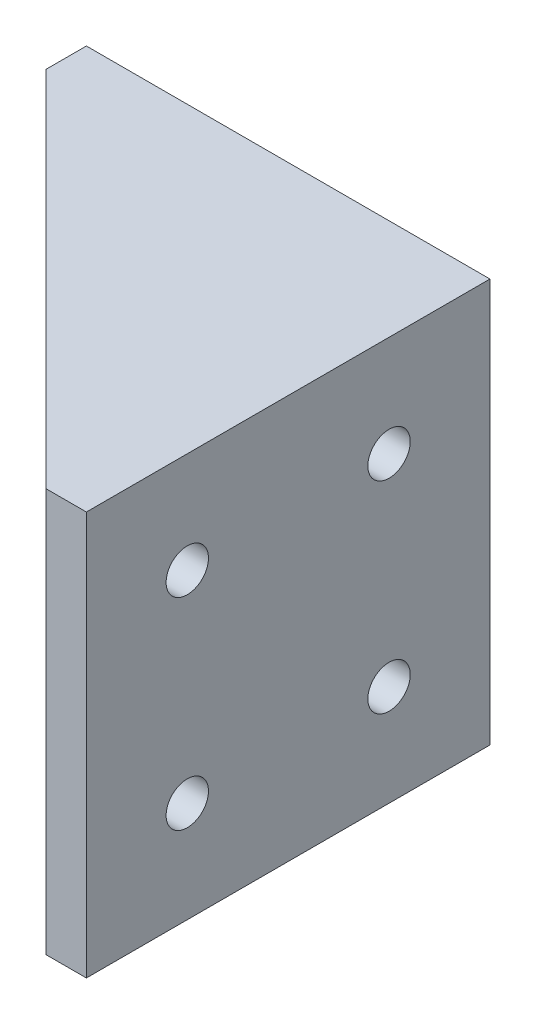
ISO-10303-21;
HEADER;
FILE_DESCRIPTION(('STEP AP214'),'2;1');
FILE_NAME('part.step','',(''),(''),'','','');
FILE_SCHEMA(('AUTOMOTIVE_DESIGN { 1 0 10303 214 1 1 1 1 }'));
ENDSEC;
DATA;
#1=APPLICATION_CONTEXT('core data for automotive mechanical design processes');
#2=APPLICATION_PROTOCOL_DEFINITION('international standard','automotive_design',2000,#1);
#3=PRODUCT_CONTEXT('',#1,'mechanical');
#4=PRODUCT('Part','Part','',(#3));
#5=PRODUCT_RELATED_PRODUCT_CATEGORY('part','',(#4));
#6=PRODUCT_DEFINITION_FORMATION('','',#4);
#7=PRODUCT_DEFINITION_CONTEXT('part definition',#1,'design');
#8=PRODUCT_DEFINITION('design','',#6,#7);
#9=PRODUCT_DEFINITION_SHAPE('','',#8);
#10=(LENGTH_UNIT() NAMED_UNIT(*) SI_UNIT(.MILLI.,.METRE.));
#11=(NAMED_UNIT(*) PLANE_ANGLE_UNIT() SI_UNIT($,.RADIAN.));
#12=(NAMED_UNIT(*) SI_UNIT($,.STERADIAN.) SOLID_ANGLE_UNIT());
#13=UNCERTAINTY_MEASURE_WITH_UNIT(LENGTH_MEASURE(1.E-05),#10,'distance_accuracy_value','');
#14=(GEOMETRIC_REPRESENTATION_CONTEXT(3) GLOBAL_UNCERTAINTY_ASSIGNED_CONTEXT((#13)) GLOBAL_UNIT_ASSIGNED_CONTEXT((#10,
#11,#12)) REPRESENTATION_CONTEXT('',''));
#15=CARTESIAN_POINT('',(0.,0.,0.));
#16=DIRECTION('',(0.,0.,1.));
#17=DIRECTION('',(1.,0.,0.));
#18=AXIS2_PLACEMENT_3D('',#15,#16,#17);
#19=CARTESIAN_POINT('',(-4.,40.,-36.));
#20=DIRECTION('',(0.,0.,-1.));
#21=DIRECTION('',(-1.,0.,0.));
#22=AXIS2_PLACEMENT_3D('',#19,#20,#21);
#23=PLANE('',#22);
#24=CARTESIAN_POINT('',(-30.,30.,-36.));
#25=DIRECTION('',(0.,0.,-1.));
#26=DIRECTION('',(-1.,0.,0.));
#27=AXIS2_PLACEMENT_3D('',#24,#25,#26);
#28=CIRCLE('',#27,2.1);
#29=CARTESIAN_POINT('',(-32.1,30.,-36.));
#30=VERTEX_POINT('',#29);
#31=EDGE_CURVE('E168',#30,#30,#28,.T.);
#32=ORIENTED_EDGE('',*,*,#31,.T.);
#33=EDGE_LOOP('',(#32));
#34=FACE_BOUND('',#33,.T.);
#35=CARTESIAN_POINT('',(-30.,10.,-36.));
#36=DIRECTION('',(0.,0.,-1.));
#37=DIRECTION('',(-1.,0.,0.));
#38=AXIS2_PLACEMENT_3D('',#35,#36,#37);
#39=CIRCLE('',#38,2.1);
#40=CARTESIAN_POINT('',(-32.1,10.,-36.));
#41=VERTEX_POINT('',#40);
#42=EDGE_CURVE('E198',#41,#41,#39,.T.);
#43=ORIENTED_EDGE('',*,*,#42,.T.);
#44=EDGE_LOOP('',(#43));
#45=FACE_BOUND('',#44,.T.);
#46=CARTESIAN_POINT('',(-10.,10.,-36.));
#47=DIRECTION('',(0.,0.,-1.));
#48=DIRECTION('',(-1.,0.,0.));
#49=AXIS2_PLACEMENT_3D('',#46,#47,#48);
#50=CIRCLE('',#49,2.1);
#51=CARTESIAN_POINT('',(-12.1,10.,-36.));
#52=VERTEX_POINT('',#51);
#53=EDGE_CURVE('E201',#52,#52,#50,.T.);
#54=ORIENTED_EDGE('',*,*,#53,.T.);
#55=EDGE_LOOP('',(#54));
#56=FACE_BOUND('',#55,.T.);
#57=CARTESIAN_POINT('',(-10.,30.,-36.));
#58=DIRECTION('',(0.,0.,-1.));
#59=DIRECTION('',(-1.,0.,0.));
#60=AXIS2_PLACEMENT_3D('',#57,#58,#59);
#61=CIRCLE('',#60,2.1);
#62=CARTESIAN_POINT('',(-12.1,30.,-36.));
#63=VERTEX_POINT('',#62);
#64=EDGE_CURVE('E112',#63,#63,#61,.T.);
#65=ORIENTED_EDGE('',*,*,#64,.T.);
#66=EDGE_LOOP('',(#65));
#67=FACE_BOUND('',#66,.T.);
#68=DIRECTION('',(1.,0.,0.));
#69=VECTOR('',#68,1.);
#70=CARTESIAN_POINT('',(-40.,4.,-36.));
#71=LINE('',#70,#69);
#72=CARTESIAN_POINT('',(-40.,4.,-36.));
#73=VERTEX_POINT('',#72);
#74=CARTESIAN_POINT('',(-4.,4.,-36.));
#75=VERTEX_POINT('',#74);
#76=EDGE_CURVE('E57',#73,#75,#71,.T.);
#77=ORIENTED_EDGE('',*,*,#76,.T.);
#78=DIRECTION('',(0.,-1.,0.));
#79=VECTOR('',#78,1.);
#80=CARTESIAN_POINT('',(-4.,40.,-36.));
#81=LINE('',#80,#79);
#82=CARTESIAN_POINT('',(-4.,36.,-36.));
#83=VERTEX_POINT('',#82);
#84=EDGE_CURVE('E186',#83,#75,#81,.T.);
#85=ORIENTED_EDGE('',*,*,#84,.F.);
#86=DIRECTION('',(-1.,0.,0.));
#87=VECTOR('',#86,1.);
#88=CARTESIAN_POINT('',(-4.,36.,-36.));
#89=LINE('',#88,#87);
#90=CARTESIAN_POINT('',(-40.,36.,-36.));
#91=VERTEX_POINT('',#90);
#92=EDGE_CURVE('E134',#83,#91,#89,.T.);
#93=ORIENTED_EDGE('',*,*,#92,.T.);
#94=DIRECTION('',(0.,-1.,0.));
#95=VECTOR('',#94,1.);
#96=CARTESIAN_POINT('',(-40.,40.,-36.));
#97=LINE('',#96,#95);
#98=EDGE_CURVE('E188',#91,#73,#97,.T.);
#99=ORIENTED_EDGE('',*,*,#98,.T.);
#100=EDGE_LOOP('',(#77,#85,#93,#99));
#101=FACE_BOUND('',#100,.T.);
#102=ADVANCED_FACE('F33',(#34,#45,#56,#67,#101),#23,.F.);
#103=CARTESIAN_POINT('',(-4.,40.,0.));
#104=DIRECTION('',(1.,0.,0.));
#105=DIRECTION('',(0.,0.,-1.));
#106=AXIS2_PLACEMENT_3D('',#103,#104,#105);
#107=PLANE('',#106);
#108=CARTESIAN_POINT('',(-4.,30.,-10.));
#109=DIRECTION('',(1.,0.,0.));
#110=DIRECTION('',(0.,0.,-1.));
#111=AXIS2_PLACEMENT_3D('',#108,#109,#110);
#112=CIRCLE('',#111,2.1);
#113=CARTESIAN_POINT('',(-4.,30.,-12.1));
#114=VERTEX_POINT('',#113);
#115=EDGE_CURVE('E155',#114,#114,#112,.T.);
#116=ORIENTED_EDGE('',*,*,#115,.T.);
#117=EDGE_LOOP('',(#116));
#118=FACE_BOUND('',#117,.T.);
#119=CARTESIAN_POINT('',(-4.,30.,-30.));
#120=DIRECTION('',(1.,0.,0.));
#121=DIRECTION('',(0.,0.,-1.));
#122=AXIS2_PLACEMENT_3D('',#119,#120,#121);
#123=CIRCLE('',#122,2.1);
#124=CARTESIAN_POINT('',(-4.,30.,-32.1));
#125=VERTEX_POINT('',#124);
#126=EDGE_CURVE('E208',#125,#125,#123,.T.);
#127=ORIENTED_EDGE('',*,*,#126,.T.);
#128=EDGE_LOOP('',(#127));
#129=FACE_BOUND('',#128,.T.);
#130=CARTESIAN_POINT('',(-4.,10.,-30.));
#131=DIRECTION('',(1.,0.,0.));
#132=DIRECTION('',(0.,0.,-1.));
#133=AXIS2_PLACEMENT_3D('',#130,#131,#132);
#134=CIRCLE('',#133,2.1);
#135=CARTESIAN_POINT('',(-4.,10.,-32.1));
#136=VERTEX_POINT('',#135);
#137=EDGE_CURVE('E210',#136,#136,#134,.T.);
#138=ORIENTED_EDGE('',*,*,#137,.T.);
#139=EDGE_LOOP('',(#138));
#140=FACE_BOUND('',#139,.T.);
#141=CARTESIAN_POINT('',(-4.,10.,-10.));
#142=DIRECTION('',(1.,0.,0.));
#143=DIRECTION('',(0.,0.,-1.));
#144=AXIS2_PLACEMENT_3D('',#141,#142,#143);
#145=CIRCLE('',#144,2.1);
#146=CARTESIAN_POINT('',(-4.,10.,-12.1));
#147=VERTEX_POINT('',#146);
#148=EDGE_CURVE('E37',#147,#147,#145,.T.);
#149=ORIENTED_EDGE('',*,*,#148,.T.);
#150=EDGE_LOOP('',(#149));
#151=FACE_BOUND('',#150,.T.);
#152=DIRECTION('',(0.,0.,1.));
#153=VECTOR('',#152,1.);
#154=CARTESIAN_POINT('',(-4.,4.,-36.));
#155=LINE('',#154,#153);
#156=CARTESIAN_POINT('',(-4.,4.,0.));
#157=VERTEX_POINT('',#156);
#158=EDGE_CURVE('E127',#75,#157,#155,.T.);
#159=ORIENTED_EDGE('',*,*,#158,.T.);
#160=DIRECTION('',(0.,-1.,0.));
#161=VECTOR('',#160,1.);
#162=CARTESIAN_POINT('',(-4.,40.,0.));
#163=LINE('',#162,#161);
#164=CARTESIAN_POINT('',(-4.,36.,0.));
#165=VERTEX_POINT('',#164);
#166=EDGE_CURVE('E119',#165,#157,#163,.T.);
#167=ORIENTED_EDGE('',*,*,#166,.F.);
#168=DIRECTION('',(0.,0.,-1.));
#169=VECTOR('',#168,1.);
#170=CARTESIAN_POINT('',(-4.,36.,0.));
#171=LINE('',#170,#169);
#172=EDGE_CURVE('E139',#165,#83,#171,.T.);
#173=ORIENTED_EDGE('',*,*,#172,.T.);
#174=ORIENTED_EDGE('',*,*,#84,.T.);
#175=EDGE_LOOP('',(#159,#167,#173,#174));
#176=FACE_BOUND('',#175,.T.);
#177=ADVANCED_FACE('F217',(#118,#129,#140,#151,#176),#107,.F.);
#178=CARTESIAN_POINT('',(0.,40.,0.));
#179=DIRECTION('',(0.,0.,-1.));
#180=DIRECTION('',(-1.,0.,0.));
#181=AXIS2_PLACEMENT_3D('',#178,#179,#180);
#182=PLANE('',#181);
#183=DIRECTION('',(1.,0.,0.));
#184=VECTOR('',#183,1.);
#185=CARTESIAN_POINT('',(0.,0.,0.));
#186=LINE('',#185,#184);
#187=CARTESIAN_POINT('',(-4.,0.,0.));
#188=VERTEX_POINT('',#187);
#189=CARTESIAN_POINT('',(0.,0.,0.));
#190=VERTEX_POINT('',#189);
#191=EDGE_CURVE('E102',#188,#190,#186,.T.);
#192=ORIENTED_EDGE('',*,*,#191,.T.);
#193=DIRECTION('',(0.,-1.,0.));
#194=VECTOR('',#193,1.);
#195=CARTESIAN_POINT('',(0.,40.,0.));
#196=LINE('',#195,#194);
#197=CARTESIAN_POINT('',(0.,40.,0.));
#198=VERTEX_POINT('',#197);
#199=EDGE_CURVE('E11',#198,#190,#196,.T.);
#200=ORIENTED_EDGE('',*,*,#199,.F.);
#201=DIRECTION('',(1.,0.,0.));
#202=VECTOR('',#201,1.);
#203=CARTESIAN_POINT('',(0.,40.,0.));
#204=LINE('',#203,#202);
#205=CARTESIAN_POINT('',(-4.,40.,0.));
#206=VERTEX_POINT('',#205);
#207=EDGE_CURVE('E169',#206,#198,#204,.T.);
#208=ORIENTED_EDGE('',*,*,#207,.F.);
#209=EDGE_CURVE('E184',#206,#165,#163,.T.);
#210=ORIENTED_EDGE('',*,*,#209,.T.);
#211=ORIENTED_EDGE('',*,*,#166,.T.);
#212=DIRECTION('',(0.,-1.,0.));
#213=VECTOR('',#212,1.);
#214=CARTESIAN_POINT('',(-4.,4.,0.));
#215=LINE('',#214,#213);
#216=EDGE_CURVE('E116',#157,#188,#215,.T.);
#217=ORIENTED_EDGE('',*,*,#216,.T.);
#218=EDGE_LOOP('',(#192,#200,#208,#210,#211,#217));
#219=FACE_BOUND('',#218,.T.);
#220=ADVANCED_FACE('F35',(#219),#182,.F.);
#221=CARTESIAN_POINT('',(0.,40.,0.));
#222=DIRECTION('',(-1.,0.,0.));
#223=DIRECTION('',(0.,0.,1.));
#224=AXIS2_PLACEMENT_3D('',#221,#222,#223);
#225=PLANE('',#224);
#226=CARTESIAN_POINT('',(0.,10.,-10.));
#227=DIRECTION('',(1.,0.,0.));
#228=DIRECTION('',(0.,0.,-1.));
#229=AXIS2_PLACEMENT_3D('',#226,#227,#228);
#230=CIRCLE('',#229,2.1);
#231=CARTESIAN_POINT('',(0.,10.,-12.1));
#232=VERTEX_POINT('',#231);
#233=EDGE_CURVE('E142',#232,#232,#230,.T.);
#234=ORIENTED_EDGE('',*,*,#233,.F.);
#235=EDGE_LOOP('',(#234));
#236=FACE_BOUND('',#235,.T.);
#237=CARTESIAN_POINT('',(0.,10.,-30.));
#238=DIRECTION('',(1.,0.,0.));
#239=DIRECTION('',(0.,0.,-1.));
#240=AXIS2_PLACEMENT_3D('',#237,#238,#239);
#241=CIRCLE('',#240,2.1);
#242=CARTESIAN_POINT('',(0.,10.,-32.1));
#243=VERTEX_POINT('',#242);
#244=EDGE_CURVE('E148',#243,#243,#241,.T.);
#245=ORIENTED_EDGE('',*,*,#244,.F.);
#246=EDGE_LOOP('',(#245));
#247=FACE_BOUND('',#246,.T.);
#248=CARTESIAN_POINT('',(0.,30.,-30.));
#249=DIRECTION('',(1.,0.,0.));
#250=DIRECTION('',(0.,0.,-1.));
#251=AXIS2_PLACEMENT_3D('',#248,#249,#250);
#252=CIRCLE('',#251,2.1);
#253=CARTESIAN_POINT('',(0.,30.,-32.1));
#254=VERTEX_POINT('',#253);
#255=EDGE_CURVE('E144',#254,#254,#252,.T.);
#256=ORIENTED_EDGE('',*,*,#255,.F.);
#257=EDGE_LOOP('',(#256));
#258=FACE_BOUND('',#257,.T.);
#259=CARTESIAN_POINT('',(0.,30.,-10.));
#260=DIRECTION('',(1.,0.,0.));
#261=DIRECTION('',(0.,0.,-1.));
#262=AXIS2_PLACEMENT_3D('',#259,#260,#261);
#263=CIRCLE('',#262,2.1);
#264=CARTESIAN_POINT('',(0.,30.,-12.1));
#265=VERTEX_POINT('',#264);
#266=EDGE_CURVE('E147',#265,#265,#263,.T.);
#267=ORIENTED_EDGE('',*,*,#266,.F.);
#268=EDGE_LOOP('',(#267));
#269=FACE_BOUND('',#268,.T.);
#270=DIRECTION('',(0.,0.,-1.));
#271=VECTOR('',#270,1.);
#272=CARTESIAN_POINT('',(0.,0.,0.));
#273=LINE('',#272,#271);
#274=CARTESIAN_POINT('',(0.,0.,-40.));
#275=VERTEX_POINT('',#274);
#276=EDGE_CURVE('E109',#190,#275,#273,.T.);
#277=ORIENTED_EDGE('',*,*,#276,.T.);
#278=DIRECTION('',(0.,-1.,0.));
#279=VECTOR('',#278,1.);
#280=CARTESIAN_POINT('',(0.,40.,-40.));
#281=LINE('',#280,#279);
#282=CARTESIAN_POINT('',(0.,40.,-40.));
#283=VERTEX_POINT('',#282);
#284=EDGE_CURVE('E42',#283,#275,#281,.T.);
#285=ORIENTED_EDGE('',*,*,#284,.F.);
#286=DIRECTION('',(0.,0.,-1.));
#287=VECTOR('',#286,1.);
#288=CARTESIAN_POINT('',(0.,40.,0.));
#289=LINE('',#288,#287);
#290=EDGE_CURVE('E172',#198,#283,#289,.T.);
#291=ORIENTED_EDGE('',*,*,#290,.F.);
#292=ORIENTED_EDGE('',*,*,#199,.T.);
#293=EDGE_LOOP('',(#277,#285,#291,#292));
#294=FACE_BOUND('',#293,.T.);
#295=ADVANCED_FACE('F254',(#236,#247,#258,#269,#294),#225,.F.);
#296=CARTESIAN_POINT('',(0.,40.,-40.));
#297=DIRECTION('',(0.,0.,1.));
#298=DIRECTION('',(1.,0.,0.));
#299=AXIS2_PLACEMENT_3D('',#296,#297,#298);
#300=PLANE('',#299);
#301=CARTESIAN_POINT('',(-10.,30.,-40.));
#302=DIRECTION('',(0.,0.,-1.));
#303=DIRECTION('',(-1.,0.,0.));
#304=AXIS2_PLACEMENT_3D('',#301,#302,#303);
#305=CIRCLE('',#304,2.1);
#306=CARTESIAN_POINT('',(-12.1,30.,-40.));
#307=VERTEX_POINT('',#306);
#308=EDGE_CURVE('E163',#307,#307,#305,.T.);
#309=ORIENTED_EDGE('',*,*,#308,.F.);
#310=EDGE_LOOP('',(#309));
#311=FACE_BOUND('',#310,.T.);
#312=CARTESIAN_POINT('',(-10.,10.,-40.));
#313=DIRECTION('',(0.,0.,-1.));
#314=DIRECTION('',(-1.,0.,0.));
#315=AXIS2_PLACEMENT_3D('',#312,#313,#314);
#316=CIRCLE('',#315,2.1);
#317=CARTESIAN_POINT('',(-12.1,10.,-40.));
#318=VERTEX_POINT('',#317);
#319=EDGE_CURVE('E160',#318,#318,#316,.T.);
#320=ORIENTED_EDGE('',*,*,#319,.F.);
#321=EDGE_LOOP('',(#320));
#322=FACE_BOUND('',#321,.T.);
#323=CARTESIAN_POINT('',(-30.,10.,-40.));
#324=DIRECTION('',(0.,0.,-1.));
#325=DIRECTION('',(-1.,0.,0.));
#326=AXIS2_PLACEMENT_3D('',#323,#324,#325);
#327=CIRCLE('',#326,2.1);
#328=CARTESIAN_POINT('',(-32.1,10.,-40.));
#329=VERTEX_POINT('',#328);
#330=EDGE_CURVE('E156',#329,#329,#327,.T.);
#331=ORIENTED_EDGE('',*,*,#330,.F.);
#332=EDGE_LOOP('',(#331));
#333=FACE_BOUND('',#332,.T.);
#334=CARTESIAN_POINT('',(-30.,30.,-40.));
#335=DIRECTION('',(0.,0.,-1.));
#336=DIRECTION('',(-1.,0.,0.));
#337=AXIS2_PLACEMENT_3D('',#334,#335,#336);
#338=CIRCLE('',#337,2.1);
#339=CARTESIAN_POINT('',(-32.1,30.,-40.));
#340=VERTEX_POINT('',#339);
#341=EDGE_CURVE('E159',#340,#340,#338,.T.);
#342=ORIENTED_EDGE('',*,*,#341,.F.);
#343=EDGE_LOOP('',(#342));
#344=FACE_BOUND('',#343,.T.);
#345=DIRECTION('',(-1.,0.,0.));
#346=VECTOR('',#345,1.);
#347=CARTESIAN_POINT('',(0.,0.,-40.));
#348=LINE('',#347,#346);
#349=CARTESIAN_POINT('',(-40.,0.,-40.));
#350=VERTEX_POINT('',#349);
#351=EDGE_CURVE('E181',#275,#350,#348,.T.);
#352=ORIENTED_EDGE('',*,*,#351,.T.);
#353=DIRECTION('',(0.,-1.,0.));
#354=VECTOR('',#353,1.);
#355=CARTESIAN_POINT('',(-40.,40.,-40.));
#356=LINE('',#355,#354);
#357=CARTESIAN_POINT('',(-40.,40.,-40.));
#358=VERTEX_POINT('',#357);
#359=EDGE_CURVE('E191',#358,#350,#356,.T.);
#360=ORIENTED_EDGE('',*,*,#359,.F.);
#361=DIRECTION('',(-1.,0.,0.));
#362=VECTOR('',#361,1.);
#363=CARTESIAN_POINT('',(0.,40.,-40.));
#364=LINE('',#363,#362);
#365=EDGE_CURVE('E175',#283,#358,#364,.T.);
#366=ORIENTED_EDGE('',*,*,#365,.F.);
#367=ORIENTED_EDGE('',*,*,#284,.T.);
#368=EDGE_LOOP('',(#352,#360,#366,#367));
#369=FACE_BOUND('',#368,.T.);
#370=ADVANCED_FACE('F252',(#311,#322,#333,#344,#369),#300,.F.);
#371=CARTESIAN_POINT('',(-40.,40.,-40.));
#372=DIRECTION('',(1.,0.,0.));
#373=DIRECTION('',(0.,0.,-1.));
#374=AXIS2_PLACEMENT_3D('',#371,#372,#373);
#375=PLANE('',#374);
#376=DIRECTION('',(0.,0.,1.));
#377=VECTOR('',#376,1.);
#378=CARTESIAN_POINT('',(-40.,0.,-40.));
#379=LINE('',#378,#377);
#380=CARTESIAN_POINT('',(-40.,0.,-36.));
#381=VERTEX_POINT('',#380);
#382=EDGE_CURVE('E173',#350,#381,#379,.T.);
#383=ORIENTED_EDGE('',*,*,#382,.T.);
#384=DIRECTION('',(0.,-1.,0.));
#385=VECTOR('',#384,1.);
#386=CARTESIAN_POINT('',(-40.,4.,-36.));
#387=LINE('',#386,#385);
#388=EDGE_CURVE('E50',#73,#381,#387,.T.);
#389=ORIENTED_EDGE('',*,*,#388,.F.);
#390=ORIENTED_EDGE('',*,*,#98,.F.);
#391=CARTESIAN_POINT('',(-40.,40.,-36.));
#392=VERTEX_POINT('',#391);
#393=EDGE_CURVE('E189',#392,#91,#97,.T.);
#394=ORIENTED_EDGE('',*,*,#393,.F.);
#395=DIRECTION('',(0.,0.,1.));
#396=VECTOR('',#395,1.);
#397=CARTESIAN_POINT('',(-40.,40.,-40.));
#398=LINE('',#397,#396);
#399=EDGE_CURVE('E177',#358,#392,#398,.T.);
#400=ORIENTED_EDGE('',*,*,#399,.F.);
#401=ORIENTED_EDGE('',*,*,#359,.T.);
#402=EDGE_LOOP('',(#383,#389,#390,#394,#400,#401));
#403=FACE_BOUND('',#402,.T.);
#404=ADVANCED_FACE('F248',(#403),#375,.F.);
#405=CARTESIAN_POINT('',(0.,40.,0.));
#406=DIRECTION('',(0.,-1.,0.));
#407=DIRECTION('',(0.,0.,-1.));
#408=AXIS2_PLACEMENT_3D('',#405,#406,#407);
#409=PLANE('',#408);
#410=ORIENTED_EDGE('',*,*,#207,.T.);
#411=ORIENTED_EDGE('',*,*,#290,.T.);
#412=ORIENTED_EDGE('',*,*,#365,.T.);
#413=ORIENTED_EDGE('',*,*,#399,.T.);
#414=DIRECTION('',(0.707106781186547,0.,0.707106781186547));
#415=VECTOR('',#414,1.);
#416=CARTESIAN_POINT('',(-40.,40.,-36.));
#417=LINE('',#416,#415);
#418=EDGE_CURVE('E132',#392,#206,#417,.T.);
#419=ORIENTED_EDGE('',*,*,#418,.T.);
#420=EDGE_LOOP('',(#410,#411,#412,#413,#419));
#421=FACE_BOUND('',#420,.T.);
#422=ADVANCED_FACE('F251',(#421),#409,.F.);
#423=CARTESIAN_POINT('',(0.,0.,0.));
#424=DIRECTION('',(0.,-1.,0.));
#425=DIRECTION('',(0.,0.,-1.));
#426=AXIS2_PLACEMENT_3D('',#423,#424,#425);
#427=PLANE('',#426);
#428=ORIENTED_EDGE('',*,*,#191,.F.);
#429=DIRECTION('',(-0.707106781186547,0.,-0.707106781186547));
#430=VECTOR('',#429,1.);
#431=CARTESIAN_POINT('',(-4.,0.,0.));
#432=LINE('',#431,#430);
#433=EDGE_CURVE('E107',#188,#381,#432,.T.);
#434=ORIENTED_EDGE('',*,*,#433,.T.);
#435=ORIENTED_EDGE('',*,*,#382,.F.);
#436=ORIENTED_EDGE('',*,*,#351,.F.);
#437=ORIENTED_EDGE('',*,*,#276,.F.);
#438=EDGE_LOOP('',(#428,#434,#435,#436,#437));
#439=FACE_BOUND('',#438,.T.);
#440=ADVANCED_FACE('F104',(#439),#427,.T.);
#441=CARTESIAN_POINT('',(-30.,30.,0.));
#442=DIRECTION('',(0.,0.,-1.));
#443=DIRECTION('',(-1.,0.,0.));
#444=AXIS2_PLACEMENT_3D('',#441,#442,#443);
#445=CYLINDRICAL_SURFACE('',#444,2.1);
#446=ORIENTED_EDGE('',*,*,#341,.T.);
#447=EDGE_LOOP('',(#446));
#448=FACE_BOUND('',#447,.T.);
#449=ORIENTED_EDGE('',*,*,#31,.F.);
#450=EDGE_LOOP('',(#449));
#451=FACE_BOUND('',#450,.T.);
#452=ADVANCED_FACE('F315',(#448,#451),#445,.F.);
#453=CARTESIAN_POINT('',(-30.,10.,0.));
#454=DIRECTION('',(0.,0.,-1.));
#455=DIRECTION('',(-1.,0.,0.));
#456=AXIS2_PLACEMENT_3D('',#453,#454,#455);
#457=CYLINDRICAL_SURFACE('',#456,2.1);
#458=ORIENTED_EDGE('',*,*,#330,.T.);
#459=EDGE_LOOP('',(#458));
#460=FACE_BOUND('',#459,.T.);
#461=ORIENTED_EDGE('',*,*,#42,.F.);
#462=EDGE_LOOP('',(#461));
#463=FACE_BOUND('',#462,.T.);
#464=ADVANCED_FACE('F312',(#460,#463),#457,.F.);
#465=CARTESIAN_POINT('',(-10.,10.,0.));
#466=DIRECTION('',(0.,0.,-1.));
#467=DIRECTION('',(-1.,0.,0.));
#468=AXIS2_PLACEMENT_3D('',#465,#466,#467);
#469=CYLINDRICAL_SURFACE('',#468,2.1);
#470=ORIENTED_EDGE('',*,*,#319,.T.);
#471=EDGE_LOOP('',(#470));
#472=FACE_BOUND('',#471,.T.);
#473=ORIENTED_EDGE('',*,*,#53,.F.);
#474=EDGE_LOOP('',(#473));
#475=FACE_BOUND('',#474,.T.);
#476=ADVANCED_FACE('F307',(#472,#475),#469,.F.);
#477=CARTESIAN_POINT('',(-10.,30.,0.));
#478=DIRECTION('',(0.,0.,-1.));
#479=DIRECTION('',(-1.,0.,0.));
#480=AXIS2_PLACEMENT_3D('',#477,#478,#479);
#481=CYLINDRICAL_SURFACE('',#480,2.1);
#482=ORIENTED_EDGE('',*,*,#308,.T.);
#483=EDGE_LOOP('',(#482));
#484=FACE_BOUND('',#483,.T.);
#485=ORIENTED_EDGE('',*,*,#64,.F.);
#486=EDGE_LOOP('',(#485));
#487=FACE_BOUND('',#486,.T.);
#488=ADVANCED_FACE('F299',(#484,#487),#481,.F.);
#489=CARTESIAN_POINT('',(-40.,30.,-10.));
#490=DIRECTION('',(1.,0.,0.));
#491=DIRECTION('',(0.,0.,-1.));
#492=AXIS2_PLACEMENT_3D('',#489,#490,#491);
#493=CYLINDRICAL_SURFACE('',#492,2.1);
#494=ORIENTED_EDGE('',*,*,#266,.T.);
#495=EDGE_LOOP('',(#494));
#496=FACE_BOUND('',#495,.T.);
#497=ORIENTED_EDGE('',*,*,#115,.F.);
#498=EDGE_LOOP('',(#497));
#499=FACE_BOUND('',#498,.T.);
#500=ADVANCED_FACE('F294',(#496,#499),#493,.F.);
#501=CARTESIAN_POINT('',(-40.,30.,-30.));
#502=DIRECTION('',(1.,0.,0.));
#503=DIRECTION('',(0.,0.,-1.));
#504=AXIS2_PLACEMENT_3D('',#501,#502,#503);
#505=CYLINDRICAL_SURFACE('',#504,2.1);
#506=ORIENTED_EDGE('',*,*,#255,.T.);
#507=EDGE_LOOP('',(#506));
#508=FACE_BOUND('',#507,.T.);
#509=ORIENTED_EDGE('',*,*,#126,.F.);
#510=EDGE_LOOP('',(#509));
#511=FACE_BOUND('',#510,.T.);
#512=ADVANCED_FACE('F233',(#508,#511),#505,.F.);
#513=CARTESIAN_POINT('',(-40.,10.,-30.));
#514=DIRECTION('',(1.,0.,0.));
#515=DIRECTION('',(0.,0.,-1.));
#516=AXIS2_PLACEMENT_3D('',#513,#514,#515);
#517=CYLINDRICAL_SURFACE('',#516,2.1);
#518=ORIENTED_EDGE('',*,*,#244,.T.);
#519=EDGE_LOOP('',(#518));
#520=FACE_BOUND('',#519,.T.);
#521=ORIENTED_EDGE('',*,*,#137,.F.);
#522=EDGE_LOOP('',(#521));
#523=FACE_BOUND('',#522,.T.);
#524=ADVANCED_FACE('F223',(#520,#523),#517,.F.);
#525=CARTESIAN_POINT('',(-40.,10.,-10.));
#526=DIRECTION('',(1.,0.,0.));
#527=DIRECTION('',(0.,0.,-1.));
#528=AXIS2_PLACEMENT_3D('',#525,#526,#527);
#529=CYLINDRICAL_SURFACE('',#528,2.1);
#530=ORIENTED_EDGE('',*,*,#233,.T.);
#531=EDGE_LOOP('',(#530));
#532=FACE_BOUND('',#531,.T.);
#533=ORIENTED_EDGE('',*,*,#148,.F.);
#534=EDGE_LOOP('',(#533));
#535=FACE_BOUND('',#534,.T.);
#536=ADVANCED_FACE('F220',(#532,#535),#529,.F.);
#537=CARTESIAN_POINT('',(-40.,36.,-36.));
#538=DIRECTION('',(-0.707106781186547,0.,0.707106781186547));
#539=DIRECTION('',(0.707106781186548,0.,0.707106781186548));
#540=AXIS2_PLACEMENT_3D('',#537,#538,#539);
#541=PLANE('',#540);
#542=ORIENTED_EDGE('',*,*,#418,.F.);
#543=ORIENTED_EDGE('',*,*,#393,.T.);
#544=DIRECTION('',(0.707106781186547,0.,0.707106781186547));
#545=VECTOR('',#544,1.);
#546=CARTESIAN_POINT('',(-40.,36.,-36.));
#547=LINE('',#546,#545);
#548=EDGE_CURVE('E137',#91,#165,#547,.T.);
#549=ORIENTED_EDGE('',*,*,#548,.T.);
#550=ORIENTED_EDGE('',*,*,#209,.F.);
#551=EDGE_LOOP('',(#542,#543,#549,#550));
#552=FACE_BOUND('',#551,.T.);
#553=ADVANCED_FACE('F222',(#552),#541,.T.);
#554=CARTESIAN_POINT('',(0.,36.,0.));
#555=DIRECTION('',(0.,-1.,0.));
#556=DIRECTION('',(0.,0.,-1.));
#557=AXIS2_PLACEMENT_3D('',#554,#555,#556);
#558=PLANE('',#557);
#559=ORIENTED_EDGE('',*,*,#92,.F.);
#560=ORIENTED_EDGE('',*,*,#172,.F.);
#561=ORIENTED_EDGE('',*,*,#548,.F.);
#562=EDGE_LOOP('',(#559,#560,#561));
#563=FACE_BOUND('',#562,.T.);
#564=ADVANCED_FACE('F230',(#563),#558,.T.);
#565=CARTESIAN_POINT('',(-4.,4.,0.));
#566=DIRECTION('',(-0.707106781186547,0.,0.707106781186547));
#567=DIRECTION('',(0.707106781186548,0.,0.707106781186548));
#568=AXIS2_PLACEMENT_3D('',#565,#566,#567);
#569=PLANE('',#568);
#570=ORIENTED_EDGE('',*,*,#433,.F.);
#571=ORIENTED_EDGE('',*,*,#216,.F.);
#572=DIRECTION('',(-0.707106781186547,0.,-0.707106781186547));
#573=VECTOR('',#572,1.);
#574=CARTESIAN_POINT('',(-4.,4.,0.));
#575=LINE('',#574,#573);
#576=EDGE_CURVE('E123',#157,#73,#575,.T.);
#577=ORIENTED_EDGE('',*,*,#576,.T.);
#578=ORIENTED_EDGE('',*,*,#388,.T.);
#579=EDGE_LOOP('',(#570,#571,#577,#578));
#580=FACE_BOUND('',#579,.T.);
#581=ADVANCED_FACE('F125',(#580),#569,.T.);
#582=CARTESIAN_POINT('',(0.,4.,0.));
#583=DIRECTION('',(0.,-1.,0.));
#584=DIRECTION('',(0.,0.,-1.));
#585=AXIS2_PLACEMENT_3D('',#582,#583,#584);
#586=PLANE('',#585);
#587=ORIENTED_EDGE('',*,*,#76,.F.);
#588=ORIENTED_EDGE('',*,*,#576,.F.);
#589=ORIENTED_EDGE('',*,*,#158,.F.);
#590=EDGE_LOOP('',(#587,#588,#589));
#591=FACE_BOUND('',#590,.T.);
#592=ADVANCED_FACE('F283',(#591),#586,.F.);
#593=CLOSED_SHELL('',(#102,#177,#220,#295,#370,#404,#422,#440,#452,#464,#476,#488,#500,#512,
#524,#536,#553,#564,#581,#592));
#594=MANIFOLD_SOLID_BREP('B2',#593);
#595=ADVANCED_BREP_SHAPE_REPRESENTATION('',(#18,#594),#14);
#596=SHAPE_DEFINITION_REPRESENTATION(#9,#595);
ENDSEC;
END-ISO-10303-21;
